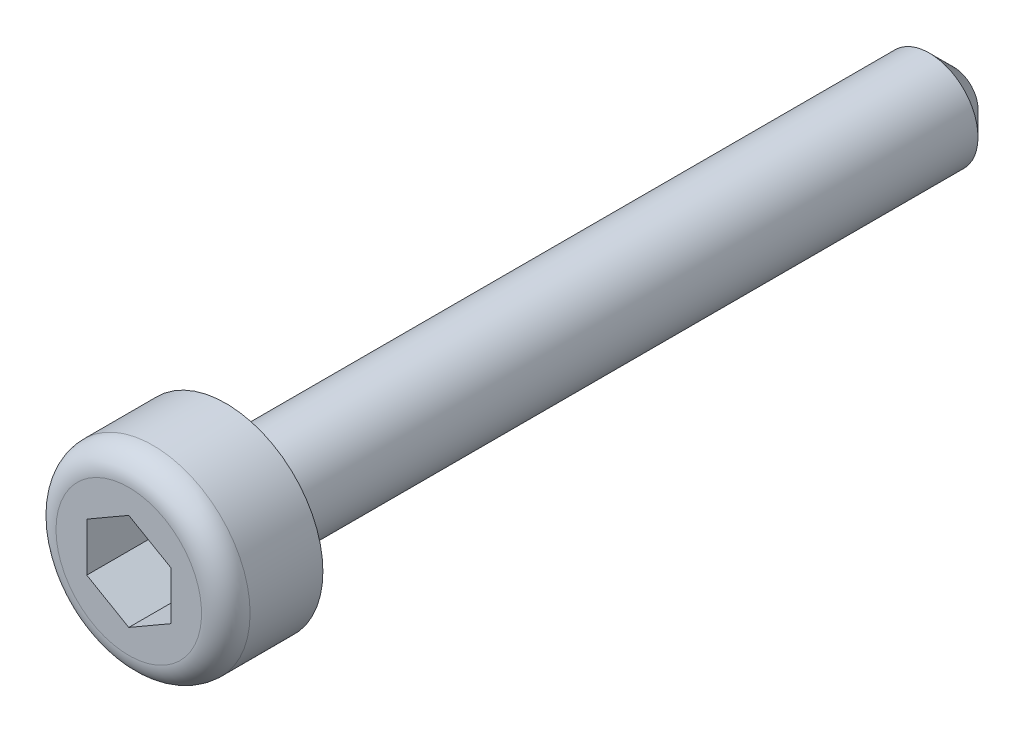
ISO-10303-21;
HEADER;
FILE_DESCRIPTION(('STEP AP214'),'2;1');
FILE_NAME('part.step','',(''),(''),'','','');
FILE_SCHEMA(('AUTOMOTIVE_DESIGN { 1 0 10303 214 1 1 1 1 }'));
ENDSEC;
DATA;
#1=APPLICATION_CONTEXT('core data for automotive mechanical design processes');
#2=APPLICATION_PROTOCOL_DEFINITION('international standard','automotive_design',2000,#1);
#3=PRODUCT_CONTEXT('',#1,'mechanical');
#4=PRODUCT('Part','Part','',(#3));
#5=PRODUCT_RELATED_PRODUCT_CATEGORY('part','',(#4));
#6=PRODUCT_DEFINITION_FORMATION('','',#4);
#7=PRODUCT_DEFINITION_CONTEXT('part definition',#1,'design');
#8=PRODUCT_DEFINITION('design','',#6,#7);
#9=PRODUCT_DEFINITION_SHAPE('','',#8);
#10=(LENGTH_UNIT() NAMED_UNIT(*) SI_UNIT(.MILLI.,.METRE.));
#11=(NAMED_UNIT(*) PLANE_ANGLE_UNIT() SI_UNIT($,.RADIAN.));
#12=(NAMED_UNIT(*) SI_UNIT($,.STERADIAN.) SOLID_ANGLE_UNIT());
#13=UNCERTAINTY_MEASURE_WITH_UNIT(LENGTH_MEASURE(1.E-05),#10,'distance_accuracy_value','');
#14=(GEOMETRIC_REPRESENTATION_CONTEXT(3) GLOBAL_UNCERTAINTY_ASSIGNED_CONTEXT((#13)) GLOBAL_UNIT_ASSIGNED_CONTEXT((#10,
#11,#12)) REPRESENTATION_CONTEXT('',''));
#15=CARTESIAN_POINT('',(0.,0.,0.));
#16=DIRECTION('',(0.,0.,1.));
#17=DIRECTION('',(1.,0.,0.));
#18=AXIS2_PLACEMENT_3D('',#15,#16,#17);
#19=CARTESIAN_POINT('',(0.,0.,0.));
#20=DIRECTION('',(0.,0.,-1.));
#21=DIRECTION('',(-1.,0.,0.));
#22=AXIS2_PLACEMENT_3D('',#19,#20,#21);
#23=PLANE('',#22);
#24=CARTESIAN_POINT('',(0.,0.,0.));
#25=DIRECTION('',(0.,0.,-1.));
#26=DIRECTION('',(-1.,0.,0.));
#27=AXIS2_PLACEMENT_3D('',#24,#25,#26);
#28=CIRCLE('',#27,3.);
#29=CARTESIAN_POINT('',(-3.,0.,0.));
#30=VERTEX_POINT('',#29);
#31=EDGE_CURVE('E41',#30,#30,#28,.F.);
#32=ORIENTED_EDGE('',*,*,#31,.T.);
#33=EDGE_LOOP('',(#32));
#34=FACE_BOUND('',#33,.T.);
#35=DIRECTION('',(-0.866025403784439,-0.5,0.));
#36=VECTOR('',#35,1.);
#37=CARTESIAN_POINT('',(0.,2.,0.));
#38=LINE('',#37,#36);
#39=CARTESIAN_POINT('',(0.,2.,0.));
#40=VERTEX_POINT('',#39);
#41=CARTESIAN_POINT('',(-1.73205080756888,1.,0.));
#42=VERTEX_POINT('',#41);
#43=EDGE_CURVE('E122',#40,#42,#38,.T.);
#44=ORIENTED_EDGE('',*,*,#43,.F.);
#45=DIRECTION('',(-0.866025403784439,0.5,0.));
#46=VECTOR('',#45,1.);
#47=CARTESIAN_POINT('',(1.73205080756888,1.,0.));
#48=LINE('',#47,#46);
#49=CARTESIAN_POINT('',(1.73205080756888,1.,0.));
#50=VERTEX_POINT('',#49);
#51=EDGE_CURVE('E48',#50,#40,#48,.T.);
#52=ORIENTED_EDGE('',*,*,#51,.F.);
#53=DIRECTION('',(0.,1.,0.));
#54=VECTOR('',#53,1.);
#55=CARTESIAN_POINT('',(1.73205080756888,-1.,0.));
#56=LINE('',#55,#54);
#57=CARTESIAN_POINT('',(1.73205080756888,-1.,0.));
#58=VERTEX_POINT('',#57);
#59=EDGE_CURVE('E131',#58,#50,#56,.T.);
#60=ORIENTED_EDGE('',*,*,#59,.F.);
#61=DIRECTION('',(0.866025403784439,0.5,0.));
#62=VECTOR('',#61,1.);
#63=CARTESIAN_POINT('',(0.,-2.,0.));
#64=LINE('',#63,#62);
#65=CARTESIAN_POINT('',(0.,-2.,0.));
#66=VERTEX_POINT('',#65);
#67=EDGE_CURVE('E129',#66,#58,#64,.T.);
#68=ORIENTED_EDGE('',*,*,#67,.F.);
#69=DIRECTION('',(0.866025403784438,-0.5,0.));
#70=VECTOR('',#69,1.);
#71=CARTESIAN_POINT('',(-1.73205080756888,-1.,0.));
#72=LINE('',#71,#70);
#73=CARTESIAN_POINT('',(-1.73205080756888,-1.,0.));
#74=VERTEX_POINT('',#73);
#75=EDGE_CURVE('E96',#74,#66,#72,.T.);
#76=ORIENTED_EDGE('',*,*,#75,.F.);
#77=DIRECTION('',(0.,-1.,0.));
#78=VECTOR('',#77,1.);
#79=CARTESIAN_POINT('',(-1.73205080756888,1.,0.));
#80=LINE('',#79,#78);
#81=EDGE_CURVE('E125',#42,#74,#80,.T.);
#82=ORIENTED_EDGE('',*,*,#81,.F.);
#83=EDGE_LOOP('',(#44,#52,#60,#68,#76,#82));
#84=FACE_BOUND('',#83,.T.);
#85=ADVANCED_FACE('F33',(#34,#84),#23,.F.);
#86=CARTESIAN_POINT('',(0.,0.,156.291575098795));
#87=DIRECTION('',(0.,0.,1.));
#88=DIRECTION('',(1.,0.,0.));
#89=AXIS2_PLACEMENT_3D('',#86,#87,#88);
#90=CYLINDRICAL_SURFACE('',#89,4.);
#91=CARTESIAN_POINT('',(0.,0.,-1.));
#92=DIRECTION('',(0.,0.,-1.));
#93=DIRECTION('',(-1.,0.,0.));
#94=AXIS2_PLACEMENT_3D('',#91,#92,#93);
#95=CIRCLE('',#94,4.);
#96=CARTESIAN_POINT('',(-4.,0.,-1.));
#97=VERTEX_POINT('',#96);
#98=EDGE_CURVE('E11',#97,#97,#95,.T.);
#99=ORIENTED_EDGE('',*,*,#98,.T.);
#100=EDGE_LOOP('',(#99));
#101=FACE_BOUND('',#100,.T.);
#102=CARTESIAN_POINT('',(0.,0.,-4.));
#103=DIRECTION('',(0.,0.,1.));
#104=DIRECTION('',(1.,0.,0.));
#105=AXIS2_PLACEMENT_3D('',#102,#103,#104);
#106=CIRCLE('',#105,4.);
#107=CARTESIAN_POINT('',(4.,0.,-4.));
#108=VERTEX_POINT('',#107);
#109=EDGE_CURVE('E143',#108,#108,#106,.T.);
#110=ORIENTED_EDGE('',*,*,#109,.T.);
#111=EDGE_LOOP('',(#110));
#112=FACE_BOUND('',#111,.T.);
#113=ADVANCED_FACE('F165',(#101,#112),#90,.T.);
#114=CARTESIAN_POINT('',(0.,4.,-4.));
#115=DIRECTION('',(0.,0.,1.));
#116=DIRECTION('',(1.,0.,0.));
#117=AXIS2_PLACEMENT_3D('',#114,#115,#116);
#118=PLANE('',#117);
#119=ORIENTED_EDGE('',*,*,#109,.F.);
#120=EDGE_LOOP('',(#119));
#121=FACE_BOUND('',#120,.T.);
#122=CARTESIAN_POINT('',(0.,0.,-4.));
#123=DIRECTION('',(0.,0.,1.));
#124=DIRECTION('',(1.,0.,0.));
#125=AXIS2_PLACEMENT_3D('',#122,#123,#124);
#126=CIRCLE('',#125,2.);
#127=CARTESIAN_POINT('',(2.,0.,-4.));
#128=VERTEX_POINT('',#127);
#129=EDGE_CURVE('E135',#128,#128,#126,.T.);
#130=ORIENTED_EDGE('',*,*,#129,.T.);
#131=EDGE_LOOP('',(#130));
#132=FACE_BOUND('',#131,.T.);
#133=ADVANCED_FACE('F170',(#121,#132),#118,.F.);
#134=CARTESIAN_POINT('',(0.,0.,156.291575098795));
#135=DIRECTION('',(0.,0.,1.));
#136=DIRECTION('',(1.,0.,0.));
#137=AXIS2_PLACEMENT_3D('',#134,#135,#136);
#138=CYLINDRICAL_SURFACE('',#137,2.);
#139=CARTESIAN_POINT('',(0.,0.,-33.));
#140=DIRECTION('',(0.,0.,1.));
#141=DIRECTION('',(1.,0.,0.));
#142=AXIS2_PLACEMENT_3D('',#139,#140,#141);
#143=CIRCLE('',#142,2.);
#144=CARTESIAN_POINT('',(2.,0.,-33.));
#145=VERTEX_POINT('',#144);
#146=EDGE_CURVE('E146',#145,#145,#143,.T.);
#147=ORIENTED_EDGE('',*,*,#146,.T.);
#148=EDGE_LOOP('',(#147));
#149=FACE_BOUND('',#148,.T.);
#150=ORIENTED_EDGE('',*,*,#129,.F.);
#151=EDGE_LOOP('',(#150));
#152=FACE_BOUND('',#151,.T.);
#153=ADVANCED_FACE('F176',(#149,#152),#138,.T.);
#154=CARTESIAN_POINT('',(0.,2.,-34.));
#155=DIRECTION('',(0.,0.,1.));
#156=DIRECTION('',(1.,0.,0.));
#157=AXIS2_PLACEMENT_3D('',#154,#155,#156);
#158=PLANE('',#157);
#159=CARTESIAN_POINT('',(0.,0.,-34.));
#160=DIRECTION('',(0.,0.,1.));
#161=DIRECTION('',(1.,0.,0.));
#162=AXIS2_PLACEMENT_3D('',#159,#160,#161);
#163=CIRCLE('',#162,0.99999999999999);
#164=CARTESIAN_POINT('',(0.99999999999999,0.,-34.));
#165=VERTEX_POINT('',#164);
#166=EDGE_CURVE('E149',#165,#165,#163,.F.);
#167=ORIENTED_EDGE('',*,*,#166,.T.);
#168=EDGE_LOOP('',(#167));
#169=FACE_BOUND('',#168,.T.);
#170=ADVANCED_FACE('F180',(#169),#158,.F.);
#171=CARTESIAN_POINT('',(1.73205080756888,1.,-3.));
#172=DIRECTION('',(0.5,0.866025403784439,0.));
#173=DIRECTION('',(-0.866025403784439,0.5,0.));
#174=AXIS2_PLACEMENT_3D('',#171,#172,#173);
#175=PLANE('',#174);
#176=ORIENTED_EDGE('',*,*,#51,.T.);
#177=DIRECTION('',(0.,0.,1.));
#178=VECTOR('',#177,1.);
#179=CARTESIAN_POINT('',(0.,2.,-3.));
#180=LINE('',#179,#178);
#181=CARTESIAN_POINT('',(0.,2.,-3.));
#182=VERTEX_POINT('',#181);
#183=EDGE_CURVE('E78',#182,#40,#180,.T.);
#184=ORIENTED_EDGE('',*,*,#183,.F.);
#185=DIRECTION('',(-0.866025403784439,0.5,0.));
#186=VECTOR('',#185,1.);
#187=CARTESIAN_POINT('',(1.73205080756888,1.,-3.));
#188=LINE('',#187,#186);
#189=CARTESIAN_POINT('',(1.73205080756888,1.,-3.));
#190=VERTEX_POINT('',#189);
#191=EDGE_CURVE('E133',#190,#182,#188,.T.);
#192=ORIENTED_EDGE('',*,*,#191,.F.);
#193=DIRECTION('',(0.,0.,1.));
#194=VECTOR('',#193,1.);
#195=CARTESIAN_POINT('',(1.73205080756888,1.,-3.));
#196=LINE('',#195,#194);
#197=EDGE_CURVE('E56',#190,#50,#196,.T.);
#198=ORIENTED_EDGE('',*,*,#197,.T.);
#199=EDGE_LOOP('',(#176,#184,#192,#198));
#200=FACE_BOUND('',#199,.T.);
#201=ADVANCED_FACE('F184',(#200),#175,.F.);
#202=CARTESIAN_POINT('',(1.73205080756888,-1.,-3.));
#203=DIRECTION('',(1.,0.,0.));
#204=DIRECTION('',(0.,1.,0.));
#205=AXIS2_PLACEMENT_3D('',#202,#203,#204);
#206=PLANE('',#205);
#207=ORIENTED_EDGE('',*,*,#59,.T.);
#208=ORIENTED_EDGE('',*,*,#197,.F.);
#209=DIRECTION('',(0.,1.,0.));
#210=VECTOR('',#209,1.);
#211=CARTESIAN_POINT('',(1.73205080756888,-1.,-3.));
#212=LINE('',#211,#210);
#213=CARTESIAN_POINT('',(1.73205080756888,-1.,-3.));
#214=VERTEX_POINT('',#213);
#215=EDGE_CURVE('E108',#214,#190,#212,.T.);
#216=ORIENTED_EDGE('',*,*,#215,.F.);
#217=DIRECTION('',(0.,0.,1.));
#218=VECTOR('',#217,1.);
#219=CARTESIAN_POINT('',(1.73205080756888,-1.,-3.));
#220=LINE('',#219,#218);
#221=EDGE_CURVE('E100',#214,#58,#220,.T.);
#222=ORIENTED_EDGE('',*,*,#221,.T.);
#223=EDGE_LOOP('',(#207,#208,#216,#222));
#224=FACE_BOUND('',#223,.T.);
#225=ADVANCED_FACE('F188',(#224),#206,.F.);
#226=CARTESIAN_POINT('',(0.,-2.,-3.));
#227=DIRECTION('',(0.5,-0.866025403784439,0.));
#228=DIRECTION('',(0.866025403784439,0.5,0.));
#229=AXIS2_PLACEMENT_3D('',#226,#227,#228);
#230=PLANE('',#229);
#231=ORIENTED_EDGE('',*,*,#67,.T.);
#232=ORIENTED_EDGE('',*,*,#221,.F.);
#233=DIRECTION('',(0.866025403784439,0.5,0.));
#234=VECTOR('',#233,1.);
#235=CARTESIAN_POINT('',(0.,-2.,-3.));
#236=LINE('',#235,#234);
#237=CARTESIAN_POINT('',(0.,-2.,-3.));
#238=VERTEX_POINT('',#237);
#239=EDGE_CURVE('E104',#238,#214,#236,.T.);
#240=ORIENTED_EDGE('',*,*,#239,.F.);
#241=DIRECTION('',(0.,0.,1.));
#242=VECTOR('',#241,1.);
#243=CARTESIAN_POINT('',(0.,-2.,-3.));
#244=LINE('',#243,#242);
#245=EDGE_CURVE('E89',#238,#66,#244,.T.);
#246=ORIENTED_EDGE('',*,*,#245,.T.);
#247=EDGE_LOOP('',(#231,#232,#240,#246));
#248=FACE_BOUND('',#247,.T.);
#249=ADVANCED_FACE('F105',(#248),#230,.F.);
#250=CARTESIAN_POINT('',(-1.73205080756888,-1.,-3.));
#251=DIRECTION('',(-0.5,-0.866025403784439,0.));
#252=DIRECTION('',(0.866025403784439,-0.5,0.));
#253=AXIS2_PLACEMENT_3D('',#250,#251,#252);
#254=PLANE('',#253);
#255=ORIENTED_EDGE('',*,*,#75,.T.);
#256=ORIENTED_EDGE('',*,*,#245,.F.);
#257=DIRECTION('',(0.866025403784438,-0.5,0.));
#258=VECTOR('',#257,1.);
#259=CARTESIAN_POINT('',(-1.73205080756888,-1.,-3.));
#260=LINE('',#259,#258);
#261=CARTESIAN_POINT('',(-1.73205080756888,-1.,-3.));
#262=VERTEX_POINT('',#261);
#263=EDGE_CURVE('E93',#262,#238,#260,.T.);
#264=ORIENTED_EDGE('',*,*,#263,.F.);
#265=DIRECTION('',(0.,0.,1.));
#266=VECTOR('',#265,1.);
#267=CARTESIAN_POINT('',(-1.73205080756888,-1.,-3.));
#268=LINE('',#267,#266);
#269=EDGE_CURVE('E101',#262,#74,#268,.T.);
#270=ORIENTED_EDGE('',*,*,#269,.T.);
#271=EDGE_LOOP('',(#255,#256,#264,#270));
#272=FACE_BOUND('',#271,.T.);
#273=ADVANCED_FACE('F91',(#272),#254,.F.);
#274=CARTESIAN_POINT('',(-1.73205080756888,1.,-3.));
#275=DIRECTION('',(-1.,0.,0.));
#276=DIRECTION('',(0.,-1.,0.));
#277=AXIS2_PLACEMENT_3D('',#274,#275,#276);
#278=PLANE('',#277);
#279=ORIENTED_EDGE('',*,*,#81,.T.);
#280=ORIENTED_EDGE('',*,*,#269,.F.);
#281=DIRECTION('',(0.,-1.,0.));
#282=VECTOR('',#281,1.);
#283=CARTESIAN_POINT('',(-1.73205080756888,1.,-3.));
#284=LINE('',#283,#282);
#285=CARTESIAN_POINT('',(-1.73205080756888,1.,-3.));
#286=VERTEX_POINT('',#285);
#287=EDGE_CURVE('E114',#286,#262,#284,.T.);
#288=ORIENTED_EDGE('',*,*,#287,.F.);
#289=DIRECTION('',(0.,0.,1.));
#290=VECTOR('',#289,1.);
#291=CARTESIAN_POINT('',(-1.73205080756888,1.,-3.));
#292=LINE('',#291,#290);
#293=EDGE_CURVE('E138',#286,#42,#292,.T.);
#294=ORIENTED_EDGE('',*,*,#293,.T.);
#295=EDGE_LOOP('',(#279,#280,#288,#294));
#296=FACE_BOUND('',#295,.T.);
#297=ADVANCED_FACE('F192',(#296),#278,.F.);
#298=CARTESIAN_POINT('',(0.,2.,-3.));
#299=DIRECTION('',(-0.5,0.866025403784439,0.));
#300=DIRECTION('',(-0.866025403784439,-0.5,0.));
#301=AXIS2_PLACEMENT_3D('',#298,#299,#300);
#302=PLANE('',#301);
#303=ORIENTED_EDGE('',*,*,#43,.T.);
#304=ORIENTED_EDGE('',*,*,#293,.F.);
#305=DIRECTION('',(-0.866025403784439,-0.5,0.));
#306=VECTOR('',#305,1.);
#307=CARTESIAN_POINT('',(0.,2.,-3.));
#308=LINE('',#307,#306);
#309=EDGE_CURVE('E116',#182,#286,#308,.T.);
#310=ORIENTED_EDGE('',*,*,#309,.F.);
#311=ORIENTED_EDGE('',*,*,#183,.T.);
#312=EDGE_LOOP('',(#303,#304,#310,#311));
#313=FACE_BOUND('',#312,.T.);
#314=ADVANCED_FACE('F189',(#313),#302,.F.);
#315=CARTESIAN_POINT('',(0.,0.,-3.));
#316=DIRECTION('',(0.,0.,1.));
#317=DIRECTION('',(1.,0.,0.));
#318=AXIS2_PLACEMENT_3D('',#315,#316,#317);
#319=PLANE('',#318);
#320=ORIENTED_EDGE('',*,*,#191,.T.);
#321=ORIENTED_EDGE('',*,*,#309,.T.);
#322=ORIENTED_EDGE('',*,*,#287,.T.);
#323=ORIENTED_EDGE('',*,*,#263,.T.);
#324=ORIENTED_EDGE('',*,*,#239,.T.);
#325=ORIENTED_EDGE('',*,*,#215,.T.);
#326=EDGE_LOOP('',(#320,#321,#322,#323,#324,#325));
#327=FACE_BOUND('',#326,.T.);
#328=ADVANCED_FACE('F111',(#327),#319,.T.);
#329=CARTESIAN_POINT('',(0.,0.,-33.));
#330=DIRECTION('',(0.,0.,1.));
#331=DIRECTION('',(1.,0.,0.));
#332=AXIS2_PLACEMENT_3D('',#329,#330,#331);
#333=CONICAL_SURFACE('',#332,2.,0.785398163397453);
#334=ORIENTED_EDGE('',*,*,#166,.F.);
#335=EDGE_LOOP('',(#334));
#336=FACE_BOUND('',#335,.T.);
#337=ORIENTED_EDGE('',*,*,#146,.F.);
#338=EDGE_LOOP('',(#337));
#339=FACE_BOUND('',#338,.T.);
#340=ADVANCED_FACE('F157',(#336,#339),#333,.T.);
#341=CARTESIAN_POINT('',(0.,0.,-1.));
#342=DIRECTION('',(0.,0.,-1.));
#343=DIRECTION('',(-1.,0.,0.));
#344=AXIS2_PLACEMENT_3D('',#341,#342,#343);
#345=TOROIDAL_SURFACE('',#344,3.,1.);
#346=ORIENTED_EDGE('',*,*,#98,.F.);
#347=EDGE_LOOP('',(#346));
#348=FACE_BOUND('',#347,.T.);
#349=ORIENTED_EDGE('',*,*,#31,.F.);
#350=EDGE_LOOP('',(#349));
#351=FACE_BOUND('',#350,.T.);
#352=ADVANCED_FACE('F35',(#348,#351),#345,.T.);
#353=CLOSED_SHELL('',(#85,#113,#133,#153,#170,#201,#225,#249,#273,#297,#314,#328,#340,#352));
#354=MANIFOLD_SOLID_BREP('B2',#353);
#355=ADVANCED_BREP_SHAPE_REPRESENTATION('',(#18,#354),#14);
#356=SHAPE_DEFINITION_REPRESENTATION(#9,#355);
ENDSEC;
END-ISO-10303-21;
